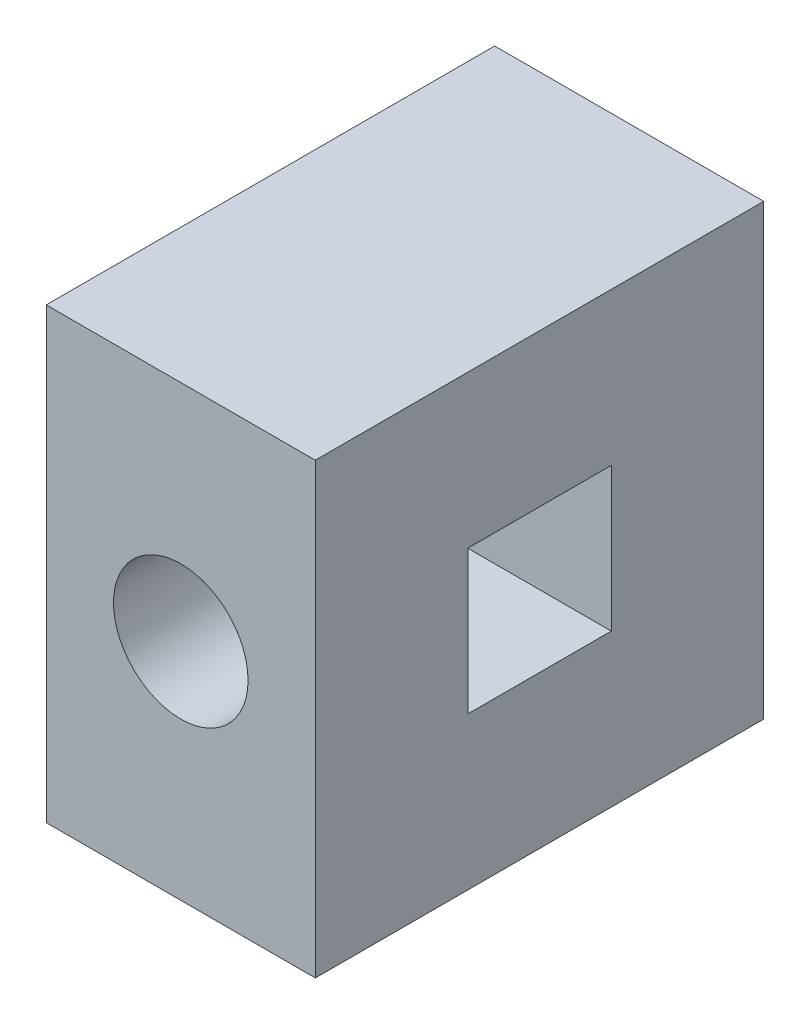
ISO-10303-21;
HEADER;
FILE_DESCRIPTION(('STEP AP214'),'2;1');
FILE_NAME('part.step','',(''),(''),'','','');
FILE_SCHEMA(('AUTOMOTIVE_DESIGN { 1 0 10303 214 1 1 1 1 }'));
ENDSEC;
DATA;
#1=APPLICATION_CONTEXT('core data for automotive mechanical design processes');
#2=APPLICATION_PROTOCOL_DEFINITION('international standard','automotive_design',2000,#1);
#3=PRODUCT_CONTEXT('',#1,'mechanical');
#4=PRODUCT('Part','Part','',(#3));
#5=PRODUCT_RELATED_PRODUCT_CATEGORY('part','',(#4));
#6=PRODUCT_DEFINITION_FORMATION('','',#4);
#7=PRODUCT_DEFINITION_CONTEXT('part definition',#1,'design');
#8=PRODUCT_DEFINITION('design','',#6,#7);
#9=PRODUCT_DEFINITION_SHAPE('','',#8);
#10=(LENGTH_UNIT() NAMED_UNIT(*) SI_UNIT(.MILLI.,.METRE.));
#11=(NAMED_UNIT(*) PLANE_ANGLE_UNIT() SI_UNIT($,.RADIAN.));
#12=(NAMED_UNIT(*) SI_UNIT($,.STERADIAN.) SOLID_ANGLE_UNIT());
#13=UNCERTAINTY_MEASURE_WITH_UNIT(LENGTH_MEASURE(1.E-05),#10,'distance_accuracy_value','');
#14=(GEOMETRIC_REPRESENTATION_CONTEXT(3) GLOBAL_UNCERTAINTY_ASSIGNED_CONTEXT((#13)) GLOBAL_UNIT_ASSIGNED_CONTEXT((#10,
#11,#12)) REPRESENTATION_CONTEXT('',''));
#15=CARTESIAN_POINT('',(0.,0.,0.));
#16=DIRECTION('',(0.,0.,1.));
#17=DIRECTION('',(1.,0.,0.));
#18=AXIS2_PLACEMENT_3D('',#15,#16,#17);
#19=CARTESIAN_POINT('',(0.,0.,10.));
#20=DIRECTION('',(0.,0.,-1.));
#21=DIRECTION('',(-1.,0.,0.));
#22=AXIS2_PLACEMENT_3D('',#19,#20,#21);
#23=PLANE('',#22);
#24=DIRECTION('',(0.,-1.,0.));
#25=VECTOR('',#24,1.);
#26=CARTESIAN_POINT('',(0.,0.,10.));
#27=LINE('',#26,#25);
#28=CARTESIAN_POINT('',(0.,10.,10.));
#29=VERTEX_POINT('',#28);
#30=CARTESIAN_POINT('',(0.,0.,10.));
#31=VERTEX_POINT('',#30);
#32=EDGE_CURVE('E152',#29,#31,#27,.T.);
#33=ORIENTED_EDGE('',*,*,#32,.T.);
#34=DIRECTION('',(1.,0.,0.));
#35=VECTOR('',#34,1.);
#36=CARTESIAN_POINT('',(0.,0.,10.));
#37=LINE('',#36,#35);
#38=CARTESIAN_POINT('',(6.,0.,10.));
#39=VERTEX_POINT('',#38);
#40=EDGE_CURVE('E155',#31,#39,#37,.T.);
#41=ORIENTED_EDGE('',*,*,#40,.T.);
#42=DIRECTION('',(0.,1.,0.));
#43=VECTOR('',#42,1.);
#44=CARTESIAN_POINT('',(6.,0.,10.));
#45=LINE('',#44,#43);
#46=CARTESIAN_POINT('',(6.,10.,10.));
#47=VERTEX_POINT('',#46);
#48=EDGE_CURVE('E158',#39,#47,#45,.T.);
#49=ORIENTED_EDGE('',*,*,#48,.T.);
#50=DIRECTION('',(-1.,0.,0.));
#51=VECTOR('',#50,1.);
#52=CARTESIAN_POINT('',(0.,10.,10.));
#53=LINE('',#52,#51);
#54=EDGE_CURVE('E160',#47,#29,#53,.T.);
#55=ORIENTED_EDGE('',*,*,#54,.T.);
#56=EDGE_LOOP('',(#33,#41,#49,#55));
#57=FACE_BOUND('',#56,.T.);
#58=CARTESIAN_POINT('',(3.,5.,10.));
#59=DIRECTION('',(0.,0.,1.));
#60=DIRECTION('',(1.,0.,0.));
#61=AXIS2_PLACEMENT_3D('',#58,#59,#60);
#62=CIRCLE('',#61,1.5);
#63=CARTESIAN_POINT('',(4.5,5.,10.));
#64=VERTEX_POINT('',#63);
#65=EDGE_CURVE('E148',#64,#64,#62,.T.);
#66=ORIENTED_EDGE('',*,*,#65,.F.);
#67=EDGE_LOOP('',(#66));
#68=FACE_BOUND('',#67,.T.);
#69=ADVANCED_FACE('F48',(#57,#68),#23,.F.);
#70=CARTESIAN_POINT('',(0.,0.,0.));
#71=DIRECTION('',(0.,0.,-1.));
#72=DIRECTION('',(-1.,0.,0.));
#73=AXIS2_PLACEMENT_3D('',#70,#71,#72);
#74=PLANE('',#73);
#75=DIRECTION('',(0.,-1.,0.));
#76=VECTOR('',#75,1.);
#77=CARTESIAN_POINT('',(0.,0.,0.));
#78=LINE('',#77,#76);
#79=CARTESIAN_POINT('',(0.,10.,0.));
#80=VERTEX_POINT('',#79);
#81=CARTESIAN_POINT('',(0.,0.,0.));
#82=VERTEX_POINT('',#81);
#83=EDGE_CURVE('E151',#80,#82,#78,.T.);
#84=ORIENTED_EDGE('',*,*,#83,.F.);
#85=DIRECTION('',(-1.,0.,0.));
#86=VECTOR('',#85,1.);
#87=CARTESIAN_POINT('',(0.,10.,0.));
#88=LINE('',#87,#86);
#89=CARTESIAN_POINT('',(6.,10.,0.));
#90=VERTEX_POINT('',#89);
#91=EDGE_CURVE('E156',#90,#80,#88,.T.);
#92=ORIENTED_EDGE('',*,*,#91,.F.);
#93=DIRECTION('',(0.,1.,0.));
#94=VECTOR('',#93,1.);
#95=CARTESIAN_POINT('',(6.,0.,0.));
#96=LINE('',#95,#94);
#97=CARTESIAN_POINT('',(6.,0.,0.));
#98=VERTEX_POINT('',#97);
#99=EDGE_CURVE('E168',#98,#90,#96,.T.);
#100=ORIENTED_EDGE('',*,*,#99,.F.);
#101=DIRECTION('',(1.,0.,0.));
#102=VECTOR('',#101,1.);
#103=CARTESIAN_POINT('',(0.,0.,0.));
#104=LINE('',#103,#102);
#105=EDGE_CURVE('E165',#82,#98,#104,.T.);
#106=ORIENTED_EDGE('',*,*,#105,.F.);
#107=EDGE_LOOP('',(#84,#92,#100,#106));
#108=FACE_BOUND('',#107,.T.);
#109=ADVANCED_FACE('F189',(#108),#74,.T.);
#110=CARTESIAN_POINT('',(0.,0.,10.));
#111=DIRECTION('',(1.,0.,0.));
#112=DIRECTION('',(0.,1.,0.));
#113=AXIS2_PLACEMENT_3D('',#110,#111,#112);
#114=PLANE('',#113);
#115=DIRECTION('',(0.,0.,-1.));
#116=VECTOR('',#115,1.);
#117=CARTESIAN_POINT('',(0.,3.4,6.6));
#118=LINE('',#117,#116);
#119=CARTESIAN_POINT('',(0.,3.4,6.6));
#120=VERTEX_POINT('',#119);
#121=CARTESIAN_POINT('',(0.,3.4,3.4));
#122=VERTEX_POINT('',#121);
#123=EDGE_CURVE('E121',#120,#122,#118,.T.);
#124=ORIENTED_EDGE('',*,*,#123,.T.);
#125=DIRECTION('',(0.,1.,0.));
#126=VECTOR('',#125,1.);
#127=CARTESIAN_POINT('',(0.,3.4,3.4));
#128=LINE('',#127,#126);
#129=CARTESIAN_POINT('',(0.,6.6,3.4));
#130=VERTEX_POINT('',#129);
#131=EDGE_CURVE('E115',#122,#130,#128,.T.);
#132=ORIENTED_EDGE('',*,*,#131,.T.);
#133=DIRECTION('',(0.,0.,1.));
#134=VECTOR('',#133,1.);
#135=CARTESIAN_POINT('',(0.,6.6,6.6));
#136=LINE('',#135,#134);
#137=CARTESIAN_POINT('',(0.,6.6,6.6));
#138=VERTEX_POINT('',#137);
#139=EDGE_CURVE('E124',#130,#138,#136,.T.);
#140=ORIENTED_EDGE('',*,*,#139,.T.);
#141=DIRECTION('',(0.,-1.,0.));
#142=VECTOR('',#141,1.);
#143=CARTESIAN_POINT('',(0.,3.4,6.6));
#144=LINE('',#143,#142);
#145=EDGE_CURVE('E64',#138,#120,#144,.T.);
#146=ORIENTED_EDGE('',*,*,#145,.T.);
#147=EDGE_LOOP('',(#124,#132,#140,#146));
#148=FACE_BOUND('',#147,.T.);
#149=ORIENTED_EDGE('',*,*,#83,.T.);
#150=DIRECTION('',(0.,0.,-1.));
#151=VECTOR('',#150,1.);
#152=CARTESIAN_POINT('',(0.,0.,10.));
#153=LINE('',#152,#151);
#154=EDGE_CURVE('E12',#31,#82,#153,.T.);
#155=ORIENTED_EDGE('',*,*,#154,.F.);
#156=ORIENTED_EDGE('',*,*,#32,.F.);
#157=DIRECTION('',(0.,0.,-1.));
#158=VECTOR('',#157,1.);
#159=CARTESIAN_POINT('',(0.,10.,10.));
#160=LINE('',#159,#158);
#161=EDGE_CURVE('E162',#29,#80,#160,.T.);
#162=ORIENTED_EDGE('',*,*,#161,.T.);
#163=EDGE_LOOP('',(#149,#155,#156,#162));
#164=FACE_BOUND('',#163,.T.);
#165=ADVANCED_FACE('F50',(#148,#164),#114,.F.);
#166=CARTESIAN_POINT('',(0.,0.,10.));
#167=DIRECTION('',(0.,1.,0.));
#168=DIRECTION('',(0.,0.,1.));
#169=AXIS2_PLACEMENT_3D('',#166,#167,#168);
#170=PLANE('',#169);
#171=ORIENTED_EDGE('',*,*,#105,.T.);
#172=DIRECTION('',(0.,0.,-1.));
#173=VECTOR('',#172,1.);
#174=CARTESIAN_POINT('',(6.,0.,10.));
#175=LINE('',#174,#173);
#176=EDGE_CURVE('E57',#39,#98,#175,.T.);
#177=ORIENTED_EDGE('',*,*,#176,.F.);
#178=ORIENTED_EDGE('',*,*,#40,.F.);
#179=ORIENTED_EDGE('',*,*,#154,.T.);
#180=EDGE_LOOP('',(#171,#177,#178,#179));
#181=FACE_BOUND('',#180,.T.);
#182=ADVANCED_FACE('F185',(#181),#170,.F.);
#183=CARTESIAN_POINT('',(6.,0.,10.));
#184=DIRECTION('',(-1.,0.,0.));
#185=DIRECTION('',(0.,-1.,0.));
#186=AXIS2_PLACEMENT_3D('',#183,#184,#185);
#187=PLANE('',#186);
#188=DIRECTION('',(0.,0.,1.));
#189=VECTOR('',#188,1.);
#190=CARTESIAN_POINT('',(6.,6.6,6.6));
#191=LINE('',#190,#189);
#192=CARTESIAN_POINT('',(6.,6.6,3.4));
#193=VERTEX_POINT('',#192);
#194=CARTESIAN_POINT('',(6.,6.6,6.6));
#195=VERTEX_POINT('',#194);
#196=EDGE_CURVE('E139',#193,#195,#191,.T.);
#197=ORIENTED_EDGE('',*,*,#196,.F.);
#198=DIRECTION('',(0.,1.,0.));
#199=VECTOR('',#198,1.);
#200=CARTESIAN_POINT('',(6.,3.4,3.4));
#201=LINE('',#200,#199);
#202=CARTESIAN_POINT('',(6.,3.4,3.4));
#203=VERTEX_POINT('',#202);
#204=EDGE_CURVE('E72',#203,#193,#201,.T.);
#205=ORIENTED_EDGE('',*,*,#204,.F.);
#206=DIRECTION('',(0.,0.,-1.));
#207=VECTOR('',#206,1.);
#208=CARTESIAN_POINT('',(6.,3.4,6.6));
#209=LINE('',#208,#207);
#210=CARTESIAN_POINT('',(6.,3.4,6.6));
#211=VERTEX_POINT('',#210);
#212=EDGE_CURVE('E130',#211,#203,#209,.T.);
#213=ORIENTED_EDGE('',*,*,#212,.F.);
#214=DIRECTION('',(0.,-1.,0.));
#215=VECTOR('',#214,1.);
#216=CARTESIAN_POINT('',(6.,3.4,6.6));
#217=LINE('',#216,#215);
#218=EDGE_CURVE('E133',#195,#211,#217,.T.);
#219=ORIENTED_EDGE('',*,*,#218,.F.);
#220=EDGE_LOOP('',(#197,#205,#213,#219));
#221=FACE_BOUND('',#220,.T.);
#222=ORIENTED_EDGE('',*,*,#99,.T.);
#223=DIRECTION('',(0.,0.,-1.));
#224=VECTOR('',#223,1.);
#225=CARTESIAN_POINT('',(6.,10.,10.));
#226=LINE('',#225,#224);
#227=EDGE_CURVE('E174',#47,#90,#226,.T.);
#228=ORIENTED_EDGE('',*,*,#227,.F.);
#229=ORIENTED_EDGE('',*,*,#48,.F.);
#230=ORIENTED_EDGE('',*,*,#176,.T.);
#231=EDGE_LOOP('',(#222,#228,#229,#230));
#232=FACE_BOUND('',#231,.T.);
#233=ADVANCED_FACE('F179',(#221,#232),#187,.F.);
#234=CARTESIAN_POINT('',(0.,10.,10.));
#235=DIRECTION('',(0.,-1.,0.));
#236=DIRECTION('',(0.,0.,-1.));
#237=AXIS2_PLACEMENT_3D('',#234,#235,#236);
#238=PLANE('',#237);
#239=ORIENTED_EDGE('',*,*,#91,.T.);
#240=ORIENTED_EDGE('',*,*,#161,.F.);
#241=ORIENTED_EDGE('',*,*,#54,.F.);
#242=ORIENTED_EDGE('',*,*,#227,.T.);
#243=EDGE_LOOP('',(#239,#240,#241,#242));
#244=FACE_BOUND('',#243,.T.);
#245=ADVANCED_FACE('F192',(#244),#238,.F.);
#246=CARTESIAN_POINT('',(3.,5.,10.));
#247=DIRECTION('',(0.,0.,-1.));
#248=DIRECTION('',(-1.,0.,0.));
#249=AXIS2_PLACEMENT_3D('',#246,#247,#248);
#250=CYLINDRICAL_SURFACE('',#249,1.5);
#251=CARTESIAN_POINT('',(3.,5.,6.6));
#252=DIRECTION('',(0.,0.,1.));
#253=DIRECTION('',(1.,0.,0.));
#254=AXIS2_PLACEMENT_3D('',#251,#252,#253);
#255=CIRCLE('',#254,1.5);
#256=CARTESIAN_POINT('',(4.5,5.,6.6));
#257=VERTEX_POINT('',#256);
#258=EDGE_CURVE('E52',#257,#257,#255,.T.);
#259=ORIENTED_EDGE('',*,*,#258,.F.);
#260=EDGE_LOOP('',(#259));
#261=FACE_BOUND('',#260,.T.);
#262=ORIENTED_EDGE('',*,*,#65,.T.);
#263=EDGE_LOOP('',(#262));
#264=FACE_BOUND('',#263,.T.);
#265=ADVANCED_FACE('F208',(#261,#264),#250,.F.);
#266=CARTESIAN_POINT('',(0.,3.4,3.4));
#267=DIRECTION('',(0.,0.,-1.));
#268=DIRECTION('',(-1.,0.,0.));
#269=AXIS2_PLACEMENT_3D('',#266,#267,#268);
#270=PLANE('',#269);
#271=ORIENTED_EDGE('',*,*,#204,.T.);
#272=DIRECTION('',(1.,0.,0.));
#273=VECTOR('',#272,1.);
#274=CARTESIAN_POINT('',(0.,6.6,3.4));
#275=LINE('',#274,#273);
#276=EDGE_CURVE('E111',#130,#193,#275,.T.);
#277=ORIENTED_EDGE('',*,*,#276,.F.);
#278=ORIENTED_EDGE('',*,*,#131,.F.);
#279=DIRECTION('',(1.,0.,0.));
#280=VECTOR('',#279,1.);
#281=CARTESIAN_POINT('',(0.,3.4,3.4));
#282=LINE('',#281,#280);
#283=EDGE_CURVE('E143',#122,#203,#282,.T.);
#284=ORIENTED_EDGE('',*,*,#283,.T.);
#285=EDGE_LOOP('',(#271,#277,#278,#284));
#286=FACE_BOUND('',#285,.T.);
#287=ADVANCED_FACE('F113',(#286),#270,.F.);
#288=CARTESIAN_POINT('',(0.,3.4,6.6));
#289=DIRECTION('',(0.,-1.,0.));
#290=DIRECTION('',(1.,0.,0.));
#291=AXIS2_PLACEMENT_3D('',#288,#289,#290);
#292=PLANE('',#291);
#293=ORIENTED_EDGE('',*,*,#212,.T.);
#294=ORIENTED_EDGE('',*,*,#283,.F.);
#295=ORIENTED_EDGE('',*,*,#123,.F.);
#296=DIRECTION('',(1.,0.,0.));
#297=VECTOR('',#296,1.);
#298=CARTESIAN_POINT('',(0.,3.4,6.6));
#299=LINE('',#298,#297);
#300=EDGE_CURVE('E145',#120,#211,#299,.T.);
#301=ORIENTED_EDGE('',*,*,#300,.T.);
#302=EDGE_LOOP('',(#293,#294,#295,#301));
#303=FACE_BOUND('',#302,.T.);
#304=ADVANCED_FACE('F221',(#303),#292,.F.);
#305=CARTESIAN_POINT('',(0.,3.4,6.6));
#306=DIRECTION('',(0.,0.,1.));
#307=DIRECTION('',(1.,0.,0.));
#308=AXIS2_PLACEMENT_3D('',#305,#306,#307);
#309=PLANE('',#308);
#310=ORIENTED_EDGE('',*,*,#258,.T.);
#311=EDGE_LOOP('',(#310));
#312=FACE_BOUND('',#311,.T.);
#313=ORIENTED_EDGE('',*,*,#218,.T.);
#314=ORIENTED_EDGE('',*,*,#300,.F.);
#315=ORIENTED_EDGE('',*,*,#145,.F.);
#316=DIRECTION('',(1.,0.,0.));
#317=VECTOR('',#316,1.);
#318=CARTESIAN_POINT('',(0.,6.6,6.6));
#319=LINE('',#318,#317);
#320=EDGE_CURVE('E120',#138,#195,#319,.T.);
#321=ORIENTED_EDGE('',*,*,#320,.T.);
#322=EDGE_LOOP('',(#313,#314,#315,#321));
#323=FACE_BOUND('',#322,.T.);
#324=ADVANCED_FACE('F219',(#312,#323),#309,.F.);
#325=CARTESIAN_POINT('',(0.,6.6,6.6));
#326=DIRECTION('',(0.,1.,0.));
#327=DIRECTION('',(-1.,0.,0.));
#328=AXIS2_PLACEMENT_3D('',#325,#326,#327);
#329=PLANE('',#328);
#330=ORIENTED_EDGE('',*,*,#196,.T.);
#331=ORIENTED_EDGE('',*,*,#320,.F.);
#332=ORIENTED_EDGE('',*,*,#139,.F.);
#333=ORIENTED_EDGE('',*,*,#276,.T.);
#334=EDGE_LOOP('',(#330,#331,#332,#333));
#335=FACE_BOUND('',#334,.T.);
#336=ADVANCED_FACE('F125',(#335),#329,.F.);
#337=CLOSED_SHELL('',(#69,#109,#165,#182,#233,#245,#265,#287,#304,#324,#336));
#338=MANIFOLD_SOLID_BREP('B2',#337);
#339=ADVANCED_BREP_SHAPE_REPRESENTATION('',(#18,#338),#14);
#340=SHAPE_DEFINITION_REPRESENTATION(#9,#339);
ENDSEC;
END-ISO-10303-21;
